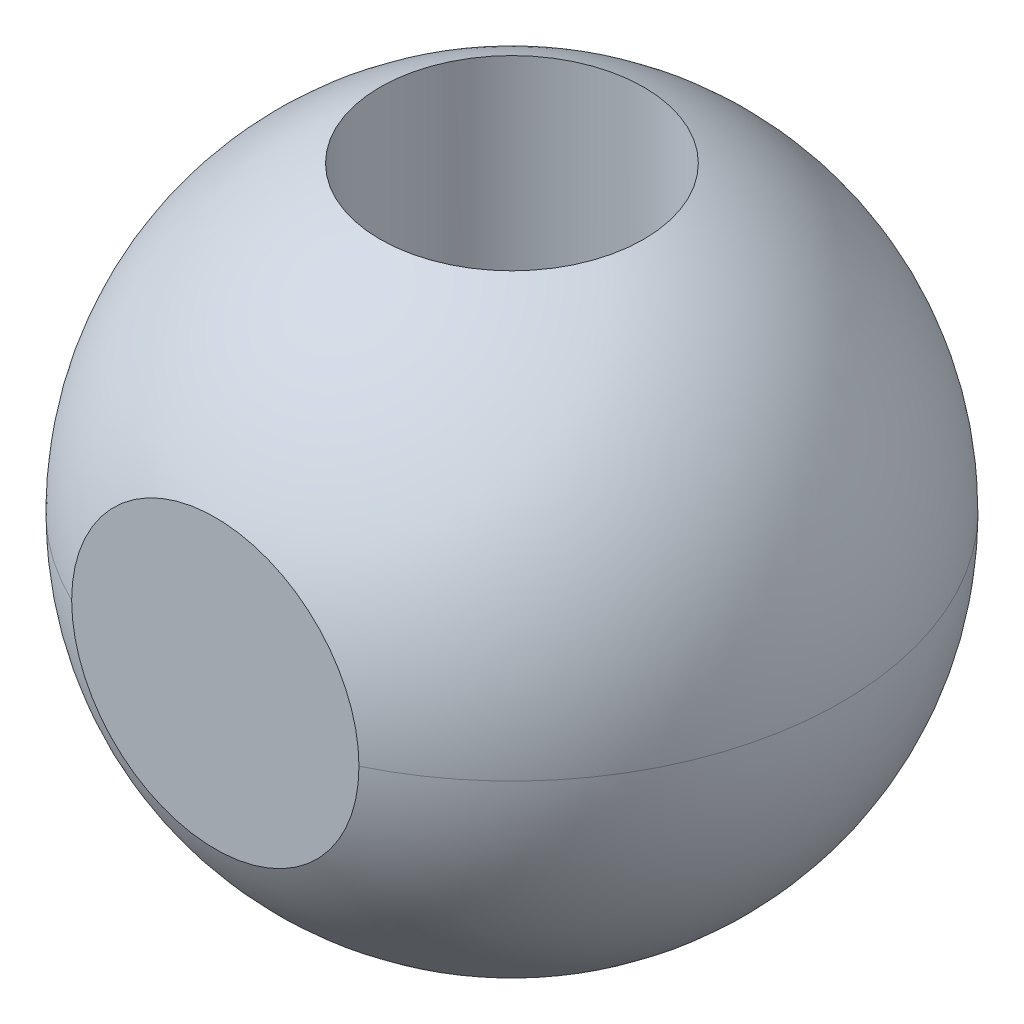
ISO-10303-21;
HEADER;
FILE_DESCRIPTION(('STEP AP214'),'2;1');
FILE_NAME('part.step','',(''),(''),'','','');
FILE_SCHEMA(('AUTOMOTIVE_DESIGN { 1 0 10303 214 1 1 1 1 }'));
ENDSEC;
DATA;
#1=APPLICATION_CONTEXT('core data for automotive mechanical design processes');
#2=APPLICATION_PROTOCOL_DEFINITION('international standard','automotive_design',2000,#1);
#3=PRODUCT_CONTEXT('',#1,'mechanical');
#4=PRODUCT('Part','Part','',(#3));
#5=PRODUCT_RELATED_PRODUCT_CATEGORY('part','',(#4));
#6=PRODUCT_DEFINITION_FORMATION('','',#4);
#7=PRODUCT_DEFINITION_CONTEXT('part definition',#1,'design');
#8=PRODUCT_DEFINITION('design','',#6,#7);
#9=PRODUCT_DEFINITION_SHAPE('','',#8);
#10=(LENGTH_UNIT() NAMED_UNIT(*) SI_UNIT(.MILLI.,.METRE.));
#11=(NAMED_UNIT(*) PLANE_ANGLE_UNIT() SI_UNIT($,.RADIAN.));
#12=(NAMED_UNIT(*) SI_UNIT($,.STERADIAN.) SOLID_ANGLE_UNIT());
#13=UNCERTAINTY_MEASURE_WITH_UNIT(LENGTH_MEASURE(1.E-05),#10,'distance_accuracy_value','');
#14=(GEOMETRIC_REPRESENTATION_CONTEXT(3) GLOBAL_UNCERTAINTY_ASSIGNED_CONTEXT((#13)) GLOBAL_UNIT_ASSIGNED_CONTEXT((#10,
#11,#12)) REPRESENTATION_CONTEXT('',''));
#15=CARTESIAN_POINT('',(0.,0.,0.));
#16=DIRECTION('',(0.,0.,1.));
#17=DIRECTION('',(1.,0.,0.));
#18=AXIS2_PLACEMENT_3D('',#15,#16,#17);
#19=CARTESIAN_POINT('',(0.,0.,0.));
#20=DIRECTION('',(0.,1.,0.));
#21=DIRECTION('',(0.,0.,1.));
#22=AXIS2_PLACEMENT_3D('',#19,#20,#21);
#23=SPHERICAL_SURFACE('',#22,12.7);
#24=CARTESIAN_POINT('',(0.,0.,11.43));
#25=DIRECTION('',(0.,0.,-1.));
#26=DIRECTION('',(-1.,0.,0.));
#27=AXIS2_PLACEMENT_3D('',#24,#25,#26);
#28=CIRCLE('',#27,5.53580165829666);
#29=CARTESIAN_POINT('',(5.53580165829666,0.,11.43));
#30=VERTEX_POINT('',#29);
#31=CARTESIAN_POINT('',(-5.53580165829666,0.,11.43));
#32=VERTEX_POINT('',#31);
#33=EDGE_CURVE('E46',#30,#32,#28,.F.);
#34=ORIENTED_EDGE('',*,*,#33,.F.);
#35=CARTESIAN_POINT('',(0.,0.,0.));
#36=DIRECTION('',(0.,-1.,0.));
#37=DIRECTION('',(0.,0.,-1.));
#38=AXIS2_PLACEMENT_3D('',#35,#36,#37);
#39=CIRCLE('',#38,12.7);
#40=EDGE_CURVE('E41',#32,#30,#39,.T.);
#41=ORIENTED_EDGE('',*,*,#40,.F.);
#42=EDGE_LOOP('',(#34,#41));
#43=FACE_BOUND('',#42,.T.);
#44=CARTESIAN_POINT('',(0.,11.6397422651878,0.));
#45=DIRECTION('',(0.,-1.,0.));
#46=DIRECTION('',(0.,0.,-1.));
#47=AXIS2_PLACEMENT_3D('',#44,#45,#46);
#48=CIRCLE('',#47,5.08);
#49=CARTESIAN_POINT('',(0.,11.6397422651878,-5.08));
#50=VERTEX_POINT('',#49);
#51=EDGE_CURVE('E57',#50,#50,#48,.F.);
#52=ORIENTED_EDGE('',*,*,#51,.F.);
#53=EDGE_LOOP('',(#52));
#54=FACE_BOUND('',#53,.T.);
#55=ADVANCED_FACE('F33',(#43,#54),#23,.T.);
#56=CARTESIAN_POINT('',(0.,0.,0.));
#57=DIRECTION('',(0.,-1.,0.));
#58=DIRECTION('',(0.,0.,-1.));
#59=AXIS2_PLACEMENT_3D('',#56,#57,#58);
#60=SPHERICAL_SURFACE('',#59,12.7);
#61=CARTESIAN_POINT('',(0.,0.,11.43));
#62=DIRECTION('',(0.,0.,-1.));
#63=DIRECTION('',(-1.,0.,0.));
#64=AXIS2_PLACEMENT_3D('',#61,#62,#63);
#65=CIRCLE('',#64,5.53580165829666);
#66=EDGE_CURVE('E11',#32,#30,#65,.F.);
#67=ORIENTED_EDGE('',*,*,#66,.F.);
#68=ORIENTED_EDGE('',*,*,#40,.T.);
#69=EDGE_LOOP('',(#67,#68));
#70=FACE_BOUND('',#69,.T.);
#71=CARTESIAN_POINT('',(0.,-11.6397422651878,0.));
#72=DIRECTION('',(0.,1.,0.));
#73=DIRECTION('',(0.,0.,1.));
#74=AXIS2_PLACEMENT_3D('',#71,#72,#73);
#75=CIRCLE('',#74,5.08);
#76=CARTESIAN_POINT('',(0.,-11.6397422651878,5.08));
#77=VERTEX_POINT('',#76);
#78=EDGE_CURVE('E54',#77,#77,#75,.F.);
#79=ORIENTED_EDGE('',*,*,#78,.F.);
#80=EDGE_LOOP('',(#79));
#81=FACE_BOUND('',#80,.T.);
#82=ADVANCED_FACE('F35',(#70,#81),#60,.T.);
#83=CARTESIAN_POINT('',(0.,-12.7,0.));
#84=DIRECTION('',(0.,1.,0.));
#85=DIRECTION('',(0.,0.,1.));
#86=AXIS2_PLACEMENT_3D('',#83,#84,#85);
#87=CYLINDRICAL_SURFACE('',#86,5.08);
#88=ORIENTED_EDGE('',*,*,#51,.T.);
#89=EDGE_LOOP('',(#88));
#90=FACE_BOUND('',#89,.T.);
#91=ORIENTED_EDGE('',*,*,#78,.T.);
#92=EDGE_LOOP('',(#91));
#93=FACE_BOUND('',#92,.T.);
#94=ADVANCED_FACE('F64',(#90,#93),#87,.F.);
#95=CARTESIAN_POINT('',(-13.0710021832809,-11.6397422651878,11.43));
#96=DIRECTION('',(0.,0.,-1.));
#97=DIRECTION('',(-1.,0.,0.));
#98=AXIS2_PLACEMENT_3D('',#95,#96,#97);
#99=PLANE('',#98);
#100=ORIENTED_EDGE('',*,*,#33,.T.);
#101=ORIENTED_EDGE('',*,*,#66,.T.);
#102=EDGE_LOOP('',(#100,#101));
#103=FACE_BOUND('',#102,.T.);
#104=ADVANCED_FACE('F48',(#103),#99,.F.);
#105=CLOSED_SHELL('',(#55,#82,#94,#104));
#106=MANIFOLD_SOLID_BREP('B2',#105);
#107=ADVANCED_BREP_SHAPE_REPRESENTATION('',(#18,#106),#14);
#108=SHAPE_DEFINITION_REPRESENTATION(#9,#107);
ENDSEC;
END-ISO-10303-21;
